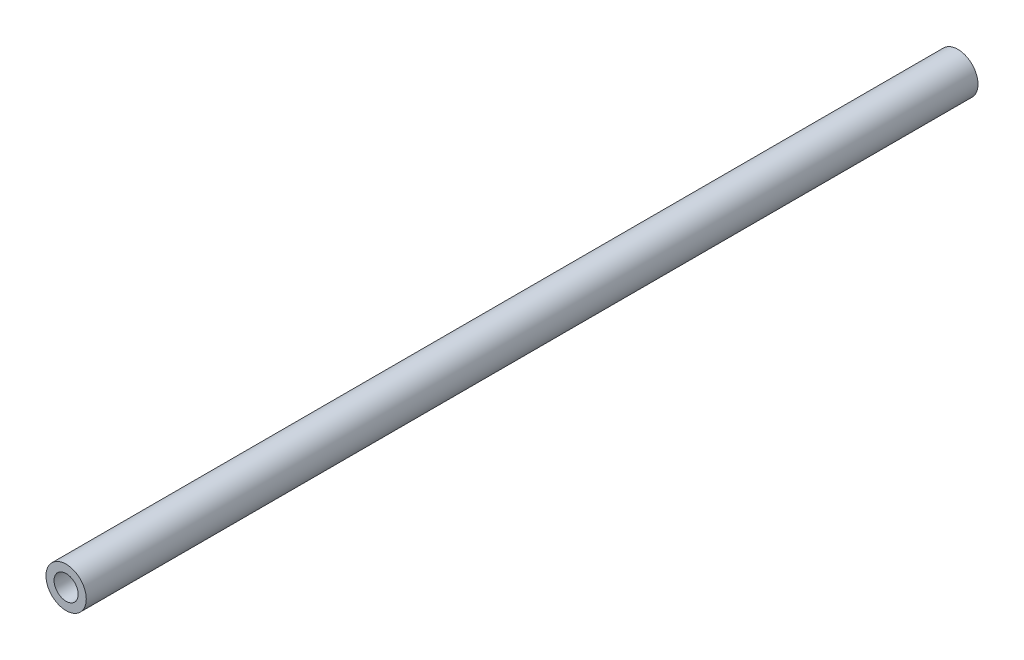
ISO-10303-21;
HEADER;
FILE_DESCRIPTION(('STEP AP214'),'2;1');
FILE_NAME('part.step','',(''),(''),'','','');
FILE_SCHEMA(('AUTOMOTIVE_DESIGN { 1 0 10303 214 1 1 1 1 }'));
ENDSEC;
DATA;
#1=APPLICATION_CONTEXT('core data for automotive mechanical design processes');
#2=APPLICATION_PROTOCOL_DEFINITION('international standard','automotive_design',2000,#1);
#3=PRODUCT_CONTEXT('',#1,'mechanical');
#4=PRODUCT('Part','Part','',(#3));
#5=PRODUCT_RELATED_PRODUCT_CATEGORY('part','',(#4));
#6=PRODUCT_DEFINITION_FORMATION('','',#4);
#7=PRODUCT_DEFINITION_CONTEXT('part definition',#1,'design');
#8=PRODUCT_DEFINITION('design','',#6,#7);
#9=PRODUCT_DEFINITION_SHAPE('','',#8);
#10=(LENGTH_UNIT() NAMED_UNIT(*) SI_UNIT(.MILLI.,.METRE.));
#11=(NAMED_UNIT(*) PLANE_ANGLE_UNIT() SI_UNIT($,.RADIAN.));
#12=(NAMED_UNIT(*) SI_UNIT($,.STERADIAN.) SOLID_ANGLE_UNIT());
#13=UNCERTAINTY_MEASURE_WITH_UNIT(LENGTH_MEASURE(1.E-05),#10,'distance_accuracy_value','');
#14=(GEOMETRIC_REPRESENTATION_CONTEXT(3) GLOBAL_UNCERTAINTY_ASSIGNED_CONTEXT((#13)) GLOBAL_UNIT_ASSIGNED_CONTEXT((#10,
#11,#12)) REPRESENTATION_CONTEXT('',''));
#15=CARTESIAN_POINT('',(0.,0.,0.));
#16=DIRECTION('',(0.,0.,1.));
#17=DIRECTION('',(1.,0.,0.));
#18=AXIS2_PLACEMENT_3D('',#15,#16,#17);
#19=CARTESIAN_POINT('',(0.,0.,140.49375));
#20=DIRECTION('',(0.,0.,1.));
#21=DIRECTION('',(1.,0.,0.));
#22=AXIS2_PLACEMENT_3D('',#19,#20,#21);
#23=PLANE('',#22);
#24=CARTESIAN_POINT('',(0.,0.,140.49375));
#25=DIRECTION('',(0.,0.,1.));
#26=DIRECTION('',(1.,0.,0.));
#27=AXIS2_PLACEMENT_3D('',#24,#25,#26);
#28=CIRCLE('',#27,3.175);
#29=CARTESIAN_POINT('',(3.175,0.,140.49375));
#30=VERTEX_POINT('',#29);
#31=EDGE_CURVE('E10',#30,#30,#28,.T.);
#32=ORIENTED_EDGE('',*,*,#31,.T.);
#33=EDGE_LOOP('',(#32));
#34=FACE_BOUND('',#33,.T.);
#35=CARTESIAN_POINT('',(0.,0.,140.49375));
#36=DIRECTION('',(0.,0.,1.));
#37=DIRECTION('',(1.,0.,0.));
#38=AXIS2_PLACEMENT_3D('',#35,#36,#37);
#39=CIRCLE('',#38,1.89865);
#40=CARTESIAN_POINT('',(1.89865,0.,140.49375));
#41=VERTEX_POINT('',#40);
#42=EDGE_CURVE('E45',#41,#41,#39,.T.);
#43=ORIENTED_EDGE('',*,*,#42,.F.);
#44=EDGE_LOOP('',(#43));
#45=FACE_BOUND('',#44,.T.);
#46=ADVANCED_FACE('F34',(#34,#45),#23,.T.);
#47=CARTESIAN_POINT('',(0.,0.,0.));
#48=DIRECTION('',(0.,0.,1.));
#49=DIRECTION('',(1.,0.,0.));
#50=AXIS2_PLACEMENT_3D('',#47,#48,#49);
#51=PLANE('',#50);
#52=CARTESIAN_POINT('',(0.,0.,0.));
#53=DIRECTION('',(0.,0.,1.));
#54=DIRECTION('',(1.,0.,0.));
#55=AXIS2_PLACEMENT_3D('',#52,#53,#54);
#56=CIRCLE('',#55,3.175);
#57=CARTESIAN_POINT('',(3.175,0.,0.));
#58=VERTEX_POINT('',#57);
#59=EDGE_CURVE('E38',#58,#58,#56,.T.);
#60=ORIENTED_EDGE('',*,*,#59,.F.);
#61=EDGE_LOOP('',(#60));
#62=FACE_BOUND('',#61,.T.);
#63=CARTESIAN_POINT('',(0.,0.,0.));
#64=DIRECTION('',(0.,0.,1.));
#65=DIRECTION('',(1.,0.,0.));
#66=AXIS2_PLACEMENT_3D('',#63,#64,#65);
#67=CIRCLE('',#66,1.89865);
#68=CARTESIAN_POINT('',(1.89865,0.,0.));
#69=VERTEX_POINT('',#68);
#70=EDGE_CURVE('E47',#69,#69,#67,.T.);
#71=ORIENTED_EDGE('',*,*,#70,.T.);
#72=EDGE_LOOP('',(#71));
#73=FACE_BOUND('',#72,.T.);
#74=ADVANCED_FACE('F57',(#62,#73),#51,.F.);
#75=CARTESIAN_POINT('',(0.,0.,140.49375));
#76=DIRECTION('',(0.,0.,-1.));
#77=DIRECTION('',(-1.,0.,0.));
#78=AXIS2_PLACEMENT_3D('',#75,#76,#77);
#79=CYLINDRICAL_SURFACE('',#78,3.175);
#80=ORIENTED_EDGE('',*,*,#31,.F.);
#81=EDGE_LOOP('',(#80));
#82=FACE_BOUND('',#81,.T.);
#83=ORIENTED_EDGE('',*,*,#59,.T.);
#84=EDGE_LOOP('',(#83));
#85=FACE_BOUND('',#84,.T.);
#86=ADVANCED_FACE('F36',(#82,#85),#79,.T.);
#87=CARTESIAN_POINT('',(0.,0.,140.49375));
#88=DIRECTION('',(0.,0.,-1.));
#89=DIRECTION('',(-1.,0.,0.));
#90=AXIS2_PLACEMENT_3D('',#87,#88,#89);
#91=CYLINDRICAL_SURFACE('',#90,1.89865);
#92=ORIENTED_EDGE('',*,*,#42,.T.);
#93=EDGE_LOOP('',(#92));
#94=FACE_BOUND('',#93,.T.);
#95=ORIENTED_EDGE('',*,*,#70,.F.);
#96=EDGE_LOOP('',(#95));
#97=FACE_BOUND('',#96,.T.);
#98=ADVANCED_FACE('F53',(#94,#97),#91,.F.);
#99=CLOSED_SHELL('',(#46,#74,#86,#98));
#100=MANIFOLD_SOLID_BREP('B2',#99);
#101=ADVANCED_BREP_SHAPE_REPRESENTATION('',(#18,#100),#14);
#102=SHAPE_DEFINITION_REPRESENTATION(#9,#101);
ENDSEC;
END-ISO-10303-21;
